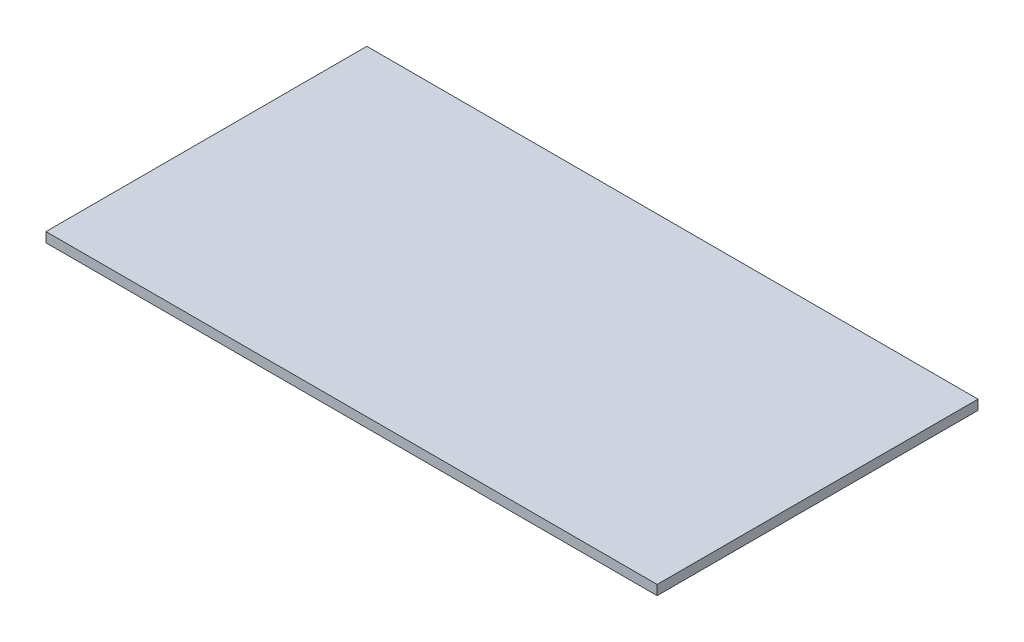
ISO-10303-21;
HEADER;
FILE_DESCRIPTION(('STEP AP214'),'2;1');
FILE_NAME('part.step','',(''),(''),'','','');
FILE_SCHEMA(('AUTOMOTIVE_DESIGN { 1 0 10303 214 1 1 1 1 }'));
ENDSEC;
DATA;
#1=APPLICATION_CONTEXT('core data for automotive mechanical design processes');
#2=APPLICATION_PROTOCOL_DEFINITION('international standard','automotive_design',2000,#1);
#3=PRODUCT_CONTEXT('',#1,'mechanical');
#4=PRODUCT('Part','Part','',(#3));
#5=PRODUCT_RELATED_PRODUCT_CATEGORY('part','',(#4));
#6=PRODUCT_DEFINITION_FORMATION('','',#4);
#7=PRODUCT_DEFINITION_CONTEXT('part definition',#1,'design');
#8=PRODUCT_DEFINITION('design','',#6,#7);
#9=PRODUCT_DEFINITION_SHAPE('','',#8);
#10=(LENGTH_UNIT() NAMED_UNIT(*) SI_UNIT(.MILLI.,.METRE.));
#11=(NAMED_UNIT(*) PLANE_ANGLE_UNIT() SI_UNIT($,.RADIAN.));
#12=(NAMED_UNIT(*) SI_UNIT($,.STERADIAN.) SOLID_ANGLE_UNIT());
#13=UNCERTAINTY_MEASURE_WITH_UNIT(LENGTH_MEASURE(1.E-05),#10,'distance_accuracy_value','');
#14=(GEOMETRIC_REPRESENTATION_CONTEXT(3) GLOBAL_UNCERTAINTY_ASSIGNED_CONTEXT((#13)) GLOBAL_UNIT_ASSIGNED_CONTEXT((#10,
#11,#12)) REPRESENTATION_CONTEXT('',''));
#15=CARTESIAN_POINT('',(0.,0.,0.));
#16=DIRECTION('',(0.,0.,1.));
#17=DIRECTION('',(1.,0.,0.));
#18=AXIS2_PLACEMENT_3D('',#15,#16,#17);
#19=CARTESIAN_POINT('',(0.,1.6256,-53.34));
#20=DIRECTION('',(1.,0.,0.));
#21=DIRECTION('',(0.,0.,-1.));
#22=AXIS2_PLACEMENT_3D('',#19,#20,#21);
#23=PLANE('',#22);
#24=DIRECTION('',(0.,0.,1.));
#25=VECTOR('',#24,1.);
#26=CARTESIAN_POINT('',(0.,0.,-53.34));
#27=LINE('',#26,#25);
#28=CARTESIAN_POINT('',(0.,0.,-53.34));
#29=VERTEX_POINT('',#28);
#30=CARTESIAN_POINT('',(0.,0.,0.));
#31=VERTEX_POINT('',#30);
#32=EDGE_CURVE('E95',#29,#31,#27,.T.);
#33=ORIENTED_EDGE('',*,*,#32,.T.);
#34=DIRECTION('',(0.,-1.,0.));
#35=VECTOR('',#34,1.);
#36=CARTESIAN_POINT('',(0.,1.6256,0.));
#37=LINE('',#36,#35);
#38=CARTESIAN_POINT('',(0.,1.6256,0.));
#39=VERTEX_POINT('',#38);
#40=EDGE_CURVE('E11',#39,#31,#37,.T.);
#41=ORIENTED_EDGE('',*,*,#40,.F.);
#42=DIRECTION('',(0.,0.,1.));
#43=VECTOR('',#42,1.);
#44=CARTESIAN_POINT('',(0.,1.6256,-53.34));
#45=LINE('',#44,#43);
#46=CARTESIAN_POINT('',(0.,1.6256,-53.34));
#47=VERTEX_POINT('',#46);
#48=EDGE_CURVE('E83',#47,#39,#45,.T.);
#49=ORIENTED_EDGE('',*,*,#48,.F.);
#50=DIRECTION('',(0.,-1.,0.));
#51=VECTOR('',#50,1.);
#52=CARTESIAN_POINT('',(0.,1.6256,-53.34));
#53=LINE('',#52,#51);
#54=EDGE_CURVE('E91',#47,#29,#53,.T.);
#55=ORIENTED_EDGE('',*,*,#54,.T.);
#56=EDGE_LOOP('',(#33,#41,#49,#55));
#57=FACE_BOUND('',#56,.T.);
#58=ADVANCED_FACE('F32',(#57),#23,.F.);
#59=CARTESIAN_POINT('',(0.,1.6256,0.));
#60=DIRECTION('',(0.,0.,-1.));
#61=DIRECTION('',(-1.,0.,0.));
#62=AXIS2_PLACEMENT_3D('',#59,#60,#61);
#63=PLANE('',#62);
#64=DIRECTION('',(1.,0.,0.));
#65=VECTOR('',#64,1.);
#66=CARTESIAN_POINT('',(0.,0.,0.));
#67=LINE('',#66,#65);
#68=CARTESIAN_POINT('',(101.6,0.,0.));
#69=VERTEX_POINT('',#68);
#70=EDGE_CURVE('E87',#31,#69,#67,.T.);
#71=ORIENTED_EDGE('',*,*,#70,.T.);
#72=DIRECTION('',(0.,-1.,0.));
#73=VECTOR('',#72,1.);
#74=CARTESIAN_POINT('',(101.6,1.6256,0.));
#75=LINE('',#74,#73);
#76=CARTESIAN_POINT('',(101.6,1.6256,0.));
#77=VERTEX_POINT('',#76);
#78=EDGE_CURVE('E40',#77,#69,#75,.T.);
#79=ORIENTED_EDGE('',*,*,#78,.F.);
#80=DIRECTION('',(1.,0.,0.));
#81=VECTOR('',#80,1.);
#82=CARTESIAN_POINT('',(0.,1.6256,0.));
#83=LINE('',#82,#81);
#84=EDGE_CURVE('E78',#39,#77,#83,.T.);
#85=ORIENTED_EDGE('',*,*,#84,.F.);
#86=ORIENTED_EDGE('',*,*,#40,.T.);
#87=EDGE_LOOP('',(#71,#79,#85,#86));
#88=FACE_BOUND('',#87,.T.);
#89=ADVANCED_FACE('F86',(#88),#63,.F.);
#90=CARTESIAN_POINT('',(101.6,1.6256,0.));
#91=DIRECTION('',(-1.,0.,0.));
#92=DIRECTION('',(0.,0.,1.));
#93=AXIS2_PLACEMENT_3D('',#90,#91,#92);
#94=PLANE('',#93);
#95=DIRECTION('',(0.,0.,-1.));
#96=VECTOR('',#95,1.);
#97=CARTESIAN_POINT('',(101.6,0.,0.));
#98=LINE('',#97,#96);
#99=CARTESIAN_POINT('',(101.6,0.,-53.34));
#100=VERTEX_POINT('',#99);
#101=EDGE_CURVE('E65',#69,#100,#98,.T.);
#102=ORIENTED_EDGE('',*,*,#101,.T.);
#103=DIRECTION('',(0.,-1.,0.));
#104=VECTOR('',#103,1.);
#105=CARTESIAN_POINT('',(101.6,1.6256,-53.34));
#106=LINE('',#105,#104);
#107=CARTESIAN_POINT('',(101.6,1.6256,-53.34));
#108=VERTEX_POINT('',#107);
#109=EDGE_CURVE('E88',#108,#100,#106,.T.);
#110=ORIENTED_EDGE('',*,*,#109,.F.);
#111=DIRECTION('',(0.,0.,-1.));
#112=VECTOR('',#111,1.);
#113=CARTESIAN_POINT('',(101.6,1.6256,0.));
#114=LINE('',#113,#112);
#115=EDGE_CURVE('E81',#77,#108,#114,.T.);
#116=ORIENTED_EDGE('',*,*,#115,.F.);
#117=ORIENTED_EDGE('',*,*,#78,.T.);
#118=EDGE_LOOP('',(#102,#110,#116,#117));
#119=FACE_BOUND('',#118,.T.);
#120=ADVANCED_FACE('F89',(#119),#94,.F.);
#121=CARTESIAN_POINT('',(101.6,1.6256,-53.34));
#122=DIRECTION('',(0.,0.,1.));
#123=DIRECTION('',(1.,0.,0.));
#124=AXIS2_PLACEMENT_3D('',#121,#122,#123);
#125=PLANE('',#124);
#126=DIRECTION('',(-1.,0.,0.));
#127=VECTOR('',#126,1.);
#128=CARTESIAN_POINT('',(101.6,0.,-53.34));
#129=LINE('',#128,#127);
#130=EDGE_CURVE('E71',#100,#29,#129,.T.);
#131=ORIENTED_EDGE('',*,*,#130,.T.);
#132=ORIENTED_EDGE('',*,*,#54,.F.);
#133=DIRECTION('',(-1.,0.,0.));
#134=VECTOR('',#133,1.);
#135=CARTESIAN_POINT('',(101.6,1.6256,-53.34));
#136=LINE('',#135,#134);
#137=EDGE_CURVE('E48',#108,#47,#136,.T.);
#138=ORIENTED_EDGE('',*,*,#137,.F.);
#139=ORIENTED_EDGE('',*,*,#109,.T.);
#140=EDGE_LOOP('',(#131,#132,#138,#139));
#141=FACE_BOUND('',#140,.T.);
#142=ADVANCED_FACE('F102',(#141),#125,.F.);
#143=CARTESIAN_POINT('',(0.,1.6256,0.));
#144=DIRECTION('',(0.,1.,0.));
#145=DIRECTION('',(0.,0.,1.));
#146=AXIS2_PLACEMENT_3D('',#143,#144,#145);
#147=PLANE('',#146);
#148=ORIENTED_EDGE('',*,*,#48,.T.);
#149=ORIENTED_EDGE('',*,*,#84,.T.);
#150=ORIENTED_EDGE('',*,*,#115,.T.);
#151=ORIENTED_EDGE('',*,*,#137,.T.);
#152=EDGE_LOOP('',(#148,#149,#150,#151));
#153=FACE_BOUND('',#152,.T.);
#154=ADVANCED_FACE('F79',(#153),#147,.T.);
#155=CARTESIAN_POINT('',(0.,0.,0.));
#156=DIRECTION('',(0.,1.,0.));
#157=DIRECTION('',(0.,0.,1.));
#158=AXIS2_PLACEMENT_3D('',#155,#156,#157);
#159=PLANE('',#158);
#160=ORIENTED_EDGE('',*,*,#32,.F.);
#161=ORIENTED_EDGE('',*,*,#130,.F.);
#162=ORIENTED_EDGE('',*,*,#101,.F.);
#163=ORIENTED_EDGE('',*,*,#70,.F.);
#164=EDGE_LOOP('',(#160,#161,#162,#163));
#165=FACE_BOUND('',#164,.T.);
#166=ADVANCED_FACE('F105',(#165),#159,.F.);
#167=CLOSED_SHELL('',(#58,#89,#120,#142,#154,#166));
#168=MANIFOLD_SOLID_BREP('B2',#167);
#169=ADVANCED_BREP_SHAPE_REPRESENTATION('',(#18,#168),#14);
#170=SHAPE_DEFINITION_REPRESENTATION(#9,#169);
ENDSEC;
END-ISO-10303-21;
